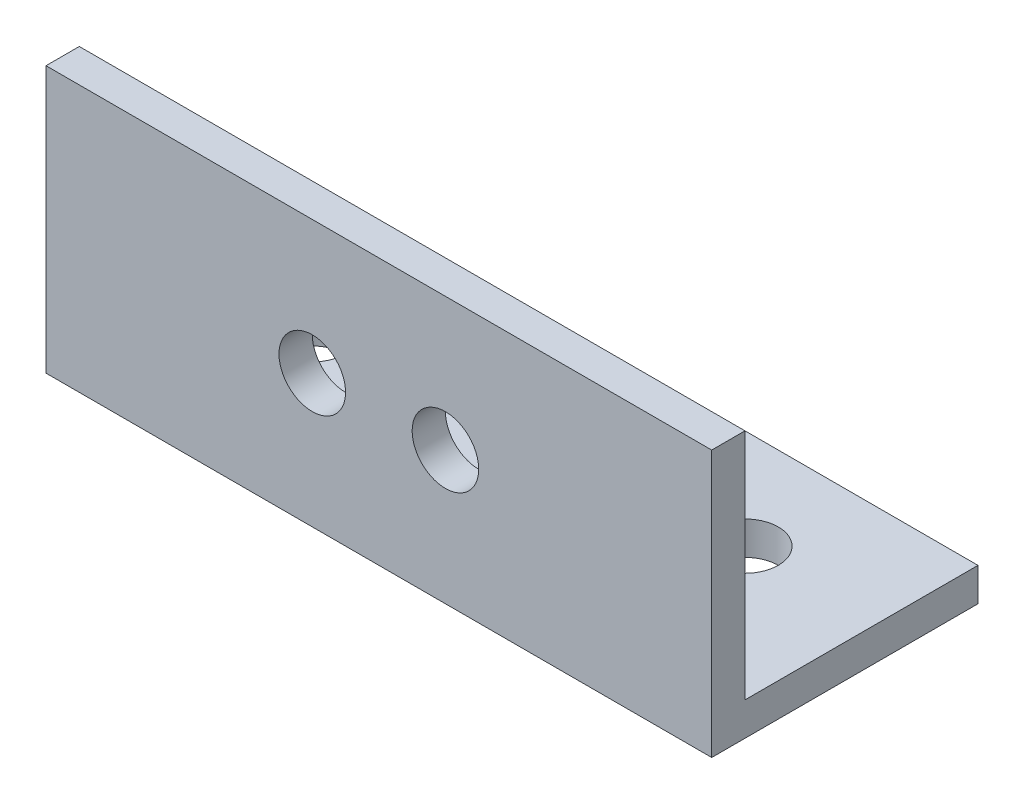
ISO-10303-21;
HEADER;
FILE_DESCRIPTION(('STEP AP214'),'2;1');
FILE_NAME('part.step','',(''),(''),'','','');
FILE_SCHEMA(('AUTOMOTIVE_DESIGN { 1 0 10303 214 1 1 1 1 }'));
ENDSEC;
DATA;
#1=APPLICATION_CONTEXT('core data for automotive mechanical design processes');
#2=APPLICATION_PROTOCOL_DEFINITION('international standard','automotive_design',2000,#1);
#3=PRODUCT_CONTEXT('',#1,'mechanical');
#4=PRODUCT('Part','Part','',(#3));
#5=PRODUCT_RELATED_PRODUCT_CATEGORY('part','',(#4));
#6=PRODUCT_DEFINITION_FORMATION('','',#4);
#7=PRODUCT_DEFINITION_CONTEXT('part definition',#1,'design');
#8=PRODUCT_DEFINITION('design','',#6,#7);
#9=PRODUCT_DEFINITION_SHAPE('','',#8);
#10=(LENGTH_UNIT() NAMED_UNIT(*) SI_UNIT(.MILLI.,.METRE.));
#11=(NAMED_UNIT(*) PLANE_ANGLE_UNIT() SI_UNIT($,.RADIAN.));
#12=(NAMED_UNIT(*) SI_UNIT($,.STERADIAN.) SOLID_ANGLE_UNIT());
#13=UNCERTAINTY_MEASURE_WITH_UNIT(LENGTH_MEASURE(1.E-05),#10,'distance_accuracy_value','');
#14=(GEOMETRIC_REPRESENTATION_CONTEXT(3) GLOBAL_UNCERTAINTY_ASSIGNED_CONTEXT((#13)) GLOBAL_UNIT_ASSIGNED_CONTEXT((#10,
#11,#12)) REPRESENTATION_CONTEXT('',''));
#15=CARTESIAN_POINT('',(0.,0.,0.));
#16=DIRECTION('',(0.,0.,1.));
#17=DIRECTION('',(1.,0.,0.));
#18=AXIS2_PLACEMENT_3D('',#15,#16,#17);
#19=CARTESIAN_POINT('',(31.75,3.175,-12.7));
#20=DIRECTION('',(-1.,0.,0.));
#21=DIRECTION('',(0.,0.,1.));
#22=AXIS2_PLACEMENT_3D('',#19,#20,#21);
#23=PLANE('',#22);
#24=DIRECTION('',(0.,0.,-1.));
#25=VECTOR('',#24,1.);
#26=CARTESIAN_POINT('',(31.75,0.,-12.7));
#27=LINE('',#26,#25);
#28=CARTESIAN_POINT('',(31.75,0.,12.7));
#29=VERTEX_POINT('',#28);
#30=CARTESIAN_POINT('',(31.75,0.,-12.7));
#31=VERTEX_POINT('',#30);
#32=EDGE_CURVE('E98',#29,#31,#27,.T.);
#33=ORIENTED_EDGE('',*,*,#32,.T.);
#34=DIRECTION('',(0.,-1.,0.));
#35=VECTOR('',#34,1.);
#36=CARTESIAN_POINT('',(31.75,3.175,-12.7));
#37=LINE('',#36,#35);
#38=CARTESIAN_POINT('',(31.75,3.175,-12.7));
#39=VERTEX_POINT('',#38);
#40=EDGE_CURVE('E11',#39,#31,#37,.T.);
#41=ORIENTED_EDGE('',*,*,#40,.F.);
#42=DIRECTION('',(0.,0.,-1.));
#43=VECTOR('',#42,1.);
#44=CARTESIAN_POINT('',(31.75,3.175,-12.7));
#45=LINE('',#44,#43);
#46=CARTESIAN_POINT('',(31.75,3.175,9.525));
#47=VERTEX_POINT('',#46);
#48=EDGE_CURVE('E91',#47,#39,#45,.T.);
#49=ORIENTED_EDGE('',*,*,#48,.F.);
#50=DIRECTION('',(0.,-1.,0.));
#51=VECTOR('',#50,1.);
#52=CARTESIAN_POINT('',(31.75,25.4,9.525));
#53=LINE('',#52,#51);
#54=CARTESIAN_POINT('',(31.75,25.4,9.525));
#55=VERTEX_POINT('',#54);
#56=EDGE_CURVE('E106',#55,#47,#53,.T.);
#57=ORIENTED_EDGE('',*,*,#56,.F.);
#58=DIRECTION('',(0.,0.,-1.));
#59=VECTOR('',#58,1.);
#60=CARTESIAN_POINT('',(31.75,25.4,12.7));
#61=LINE('',#60,#59);
#62=CARTESIAN_POINT('',(31.75,25.4,12.7));
#63=VERTEX_POINT('',#62);
#64=EDGE_CURVE('E101',#63,#55,#61,.T.);
#65=ORIENTED_EDGE('',*,*,#64,.F.);
#66=DIRECTION('',(0.,-1.,0.));
#67=VECTOR('',#66,1.);
#68=CARTESIAN_POINT('',(31.75,3.175,12.7));
#69=LINE('',#68,#67);
#70=EDGE_CURVE('E84',#63,#29,#69,.T.);
#71=ORIENTED_EDGE('',*,*,#70,.T.);
#72=EDGE_LOOP('',(#33,#41,#49,#57,#65,#71));
#73=FACE_BOUND('',#72,.T.);
#74=ADVANCED_FACE('F39',(#73),#23,.F.);
#75=CARTESIAN_POINT('',(-31.75,3.175,-12.7));
#76=DIRECTION('',(0.,0.,1.));
#77=DIRECTION('',(1.,0.,0.));
#78=AXIS2_PLACEMENT_3D('',#75,#76,#77);
#79=PLANE('',#78);
#80=DIRECTION('',(-1.,0.,0.));
#81=VECTOR('',#80,1.);
#82=CARTESIAN_POINT('',(-31.75,0.,-12.7));
#83=LINE('',#82,#81);
#84=CARTESIAN_POINT('',(-31.75,0.,-12.7));
#85=VERTEX_POINT('',#84);
#86=EDGE_CURVE('E105',#31,#85,#83,.T.);
#87=ORIENTED_EDGE('',*,*,#86,.T.);
#88=DIRECTION('',(0.,-1.,0.));
#89=VECTOR('',#88,1.);
#90=CARTESIAN_POINT('',(-31.75,3.175,-12.7));
#91=LINE('',#90,#89);
#92=CARTESIAN_POINT('',(-31.75,3.175,-12.7));
#93=VERTEX_POINT('',#92);
#94=EDGE_CURVE('E46',#93,#85,#91,.T.);
#95=ORIENTED_EDGE('',*,*,#94,.F.);
#96=DIRECTION('',(-1.,0.,0.));
#97=VECTOR('',#96,1.);
#98=CARTESIAN_POINT('',(-31.75,3.175,-12.7));
#99=LINE('',#98,#97);
#100=EDGE_CURVE('E59',#39,#93,#99,.T.);
#101=ORIENTED_EDGE('',*,*,#100,.F.);
#102=ORIENTED_EDGE('',*,*,#40,.T.);
#103=EDGE_LOOP('',(#87,#95,#101,#102));
#104=FACE_BOUND('',#103,.T.);
#105=ADVANCED_FACE('F122',(#104),#79,.F.);
#106=CARTESIAN_POINT('',(-31.75,3.175,-12.7));
#107=DIRECTION('',(1.,0.,0.));
#108=DIRECTION('',(0.,0.,-1.));
#109=AXIS2_PLACEMENT_3D('',#106,#107,#108);
#110=PLANE('',#109);
#111=DIRECTION('',(0.,0.,1.));
#112=VECTOR('',#111,1.);
#113=CARTESIAN_POINT('',(-31.75,0.,-12.7));
#114=LINE('',#113,#112);
#115=CARTESIAN_POINT('',(-31.75,0.,12.7));
#116=VERTEX_POINT('',#115);
#117=EDGE_CURVE('E92',#85,#116,#114,.T.);
#118=ORIENTED_EDGE('',*,*,#117,.T.);
#119=DIRECTION('',(0.,-1.,0.));
#120=VECTOR('',#119,1.);
#121=CARTESIAN_POINT('',(-31.75,3.175,12.7));
#122=LINE('',#121,#120);
#123=CARTESIAN_POINT('',(-31.75,25.4,12.7));
#124=VERTEX_POINT('',#123);
#125=EDGE_CURVE('E87',#124,#116,#122,.T.);
#126=ORIENTED_EDGE('',*,*,#125,.F.);
#127=DIRECTION('',(0.,0.,1.));
#128=VECTOR('',#127,1.);
#129=CARTESIAN_POINT('',(-31.75,25.4,12.7));
#130=LINE('',#129,#128);
#131=CARTESIAN_POINT('',(-31.75,25.4,9.525));
#132=VERTEX_POINT('',#131);
#133=EDGE_CURVE('E142',#132,#124,#130,.T.);
#134=ORIENTED_EDGE('',*,*,#133,.F.);
#135=DIRECTION('',(0.,-1.,0.));
#136=VECTOR('',#135,1.);
#137=CARTESIAN_POINT('',(-31.75,25.4,9.525));
#138=LINE('',#137,#136);
#139=CARTESIAN_POINT('',(-31.75,3.175,9.525));
#140=VERTEX_POINT('',#139);
#141=EDGE_CURVE('E110',#132,#140,#138,.T.);
#142=ORIENTED_EDGE('',*,*,#141,.T.);
#143=DIRECTION('',(0.,0.,1.));
#144=VECTOR('',#143,1.);
#145=CARTESIAN_POINT('',(-31.75,3.175,-12.7));
#146=LINE('',#145,#144);
#147=EDGE_CURVE('E102',#93,#140,#146,.T.);
#148=ORIENTED_EDGE('',*,*,#147,.F.);
#149=ORIENTED_EDGE('',*,*,#94,.T.);
#150=EDGE_LOOP('',(#118,#126,#134,#142,#148,#149));
#151=FACE_BOUND('',#150,.T.);
#152=ADVANCED_FACE('F119',(#151),#110,.F.);
#153=CARTESIAN_POINT('',(-31.75,3.175,12.7));
#154=DIRECTION('',(0.,0.,-1.));
#155=DIRECTION('',(-1.,0.,0.));
#156=AXIS2_PLACEMENT_3D('',#153,#154,#155);
#157=PLANE('',#156);
#158=CARTESIAN_POINT('',(6.34999999999999,12.7,12.7));
#159=DIRECTION('',(0.,0.,-1.));
#160=DIRECTION('',(-1.,0.,0.));
#161=AXIS2_PLACEMENT_3D('',#158,#159,#160);
#162=CIRCLE('',#161,3.175);
#163=CARTESIAN_POINT('',(3.17499999999999,12.7,12.7));
#164=VERTEX_POINT('',#163);
#165=EDGE_CURVE('E155',#164,#164,#162,.T.);
#166=ORIENTED_EDGE('',*,*,#165,.T.);
#167=EDGE_LOOP('',(#166));
#168=FACE_BOUND('',#167,.T.);
#169=CARTESIAN_POINT('',(-6.35000000000001,12.7,12.7));
#170=DIRECTION('',(0.,0.,-1.));
#171=DIRECTION('',(-1.,0.,0.));
#172=AXIS2_PLACEMENT_3D('',#169,#170,#171);
#173=CIRCLE('',#172,3.175);
#174=CARTESIAN_POINT('',(-9.52500000000001,12.7,12.7));
#175=VERTEX_POINT('',#174);
#176=EDGE_CURVE('E143',#175,#175,#173,.T.);
#177=ORIENTED_EDGE('',*,*,#176,.T.);
#178=EDGE_LOOP('',(#177));
#179=FACE_BOUND('',#178,.T.);
#180=DIRECTION('',(1.,0.,0.));
#181=VECTOR('',#180,1.);
#182=CARTESIAN_POINT('',(-31.75,0.,12.7));
#183=LINE('',#182,#181);
#184=EDGE_CURVE('E79',#116,#29,#183,.T.);
#185=ORIENTED_EDGE('',*,*,#184,.T.);
#186=ORIENTED_EDGE('',*,*,#70,.F.);
#187=DIRECTION('',(1.,0.,0.));
#188=VECTOR('',#187,1.);
#189=CARTESIAN_POINT('',(-31.75,25.4,12.7));
#190=LINE('',#189,#188);
#191=EDGE_CURVE('E138',#124,#63,#190,.T.);
#192=ORIENTED_EDGE('',*,*,#191,.F.);
#193=ORIENTED_EDGE('',*,*,#125,.T.);
#194=EDGE_LOOP('',(#185,#186,#192,#193));
#195=FACE_BOUND('',#194,.T.);
#196=ADVANCED_FACE('F81',(#168,#179,#195),#157,.F.);
#197=CARTESIAN_POINT('',(0.,3.175,0.));
#198=DIRECTION('',(0.,1.,0.));
#199=DIRECTION('',(0.,0.,1.));
#200=AXIS2_PLACEMENT_3D('',#197,#198,#199);
#201=PLANE('',#200);
#202=CARTESIAN_POINT('',(19.05,3.175,-3.175));
#203=DIRECTION('',(0.,1.,0.));
#204=DIRECTION('',(0.,0.,1.));
#205=AXIS2_PLACEMENT_3D('',#202,#203,#204);
#206=CIRCLE('',#205,3.175);
#207=CARTESIAN_POINT('',(19.05,3.175,0.));
#208=VERTEX_POINT('',#207);
#209=EDGE_CURVE('E170',#208,#208,#206,.T.);
#210=ORIENTED_EDGE('',*,*,#209,.F.);
#211=EDGE_LOOP('',(#210));
#212=FACE_BOUND('',#211,.T.);
#213=CARTESIAN_POINT('',(-19.05,3.175,0.));
#214=DIRECTION('',(0.,1.,0.));
#215=DIRECTION('',(0.,0.,1.));
#216=AXIS2_PLACEMENT_3D('',#213,#214,#215);
#217=CIRCLE('',#216,3.175);
#218=CARTESIAN_POINT('',(-19.05,3.175,3.175));
#219=VERTEX_POINT('',#218);
#220=EDGE_CURVE('E164',#219,#219,#217,.T.);
#221=ORIENTED_EDGE('',*,*,#220,.F.);
#222=EDGE_LOOP('',(#221));
#223=FACE_BOUND('',#222,.T.);
#224=DIRECTION('',(-1.,0.,0.));
#225=VECTOR('',#224,1.);
#226=CARTESIAN_POINT('',(-31.75,3.175,9.525));
#227=LINE('',#226,#225);
#228=EDGE_CURVE('E53',#47,#140,#227,.T.);
#229=ORIENTED_EDGE('',*,*,#228,.F.);
#230=ORIENTED_EDGE('',*,*,#48,.T.);
#231=ORIENTED_EDGE('',*,*,#100,.T.);
#232=ORIENTED_EDGE('',*,*,#147,.T.);
#233=EDGE_LOOP('',(#229,#230,#231,#232));
#234=FACE_BOUND('',#233,.T.);
#235=ADVANCED_FACE('F144',(#212,#223,#234),#201,.T.);
#236=CARTESIAN_POINT('',(0.,0.,0.));
#237=DIRECTION('',(0.,1.,0.));
#238=DIRECTION('',(0.,0.,1.));
#239=AXIS2_PLACEMENT_3D('',#236,#237,#238);
#240=PLANE('',#239);
#241=CARTESIAN_POINT('',(19.05,0.,-3.175));
#242=DIRECTION('',(0.,1.,0.));
#243=DIRECTION('',(0.,0.,1.));
#244=AXIS2_PLACEMENT_3D('',#241,#242,#243);
#245=CIRCLE('',#244,3.175);
#246=CARTESIAN_POINT('',(19.05,0.,0.));
#247=VERTEX_POINT('',#246);
#248=EDGE_CURVE('E167',#247,#247,#245,.T.);
#249=ORIENTED_EDGE('',*,*,#248,.T.);
#250=EDGE_LOOP('',(#249));
#251=FACE_BOUND('',#250,.T.);
#252=CARTESIAN_POINT('',(-19.05,0.,0.));
#253=DIRECTION('',(0.,1.,0.));
#254=DIRECTION('',(0.,0.,1.));
#255=AXIS2_PLACEMENT_3D('',#252,#253,#254);
#256=CIRCLE('',#255,3.175);
#257=CARTESIAN_POINT('',(-19.05,0.,3.175));
#258=VERTEX_POINT('',#257);
#259=EDGE_CURVE('E161',#258,#258,#256,.T.);
#260=ORIENTED_EDGE('',*,*,#259,.T.);
#261=EDGE_LOOP('',(#260));
#262=FACE_BOUND('',#261,.T.);
#263=ORIENTED_EDGE('',*,*,#32,.F.);
#264=ORIENTED_EDGE('',*,*,#184,.F.);
#265=ORIENTED_EDGE('',*,*,#117,.F.);
#266=ORIENTED_EDGE('',*,*,#86,.F.);
#267=EDGE_LOOP('',(#263,#264,#265,#266));
#268=FACE_BOUND('',#267,.T.);
#269=ADVANCED_FACE('F104',(#251,#262,#268),#240,.F.);
#270=CARTESIAN_POINT('',(-31.75,25.4,9.525));
#271=DIRECTION('',(0.,0.,1.));
#272=DIRECTION('',(1.,0.,0.));
#273=AXIS2_PLACEMENT_3D('',#270,#271,#272);
#274=PLANE('',#273);
#275=CARTESIAN_POINT('',(6.34999999999999,12.7,9.525));
#276=DIRECTION('',(0.,0.,-1.));
#277=DIRECTION('',(-1.,0.,0.));
#278=AXIS2_PLACEMENT_3D('',#275,#276,#277);
#279=CIRCLE('',#278,3.175);
#280=CARTESIAN_POINT('',(3.17499999999999,12.7,9.525));
#281=VERTEX_POINT('',#280);
#282=EDGE_CURVE('E158',#281,#281,#279,.T.);
#283=ORIENTED_EDGE('',*,*,#282,.F.);
#284=EDGE_LOOP('',(#283));
#285=FACE_BOUND('',#284,.T.);
#286=CARTESIAN_POINT('',(-6.35000000000001,12.7,9.525));
#287=DIRECTION('',(0.,0.,-1.));
#288=DIRECTION('',(-1.,0.,0.));
#289=AXIS2_PLACEMENT_3D('',#286,#287,#288);
#290=CIRCLE('',#289,3.175);
#291=CARTESIAN_POINT('',(-9.52500000000001,12.7,9.525));
#292=VERTEX_POINT('',#291);
#293=EDGE_CURVE('E152',#292,#292,#290,.T.);
#294=ORIENTED_EDGE('',*,*,#293,.F.);
#295=EDGE_LOOP('',(#294));
#296=FACE_BOUND('',#295,.T.);
#297=ORIENTED_EDGE('',*,*,#228,.T.);
#298=ORIENTED_EDGE('',*,*,#141,.F.);
#299=DIRECTION('',(-1.,0.,0.));
#300=VECTOR('',#299,1.);
#301=CARTESIAN_POINT('',(-31.75,25.4,9.525));
#302=LINE('',#301,#300);
#303=EDGE_CURVE('E131',#55,#132,#302,.T.);
#304=ORIENTED_EDGE('',*,*,#303,.F.);
#305=ORIENTED_EDGE('',*,*,#56,.T.);
#306=EDGE_LOOP('',(#297,#298,#304,#305));
#307=FACE_BOUND('',#306,.T.);
#308=ADVANCED_FACE('F127',(#285,#296,#307),#274,.F.);
#309=CARTESIAN_POINT('',(0.,25.4,0.));
#310=DIRECTION('',(0.,-1.,0.));
#311=DIRECTION('',(0.,0.,-1.));
#312=AXIS2_PLACEMENT_3D('',#309,#310,#311);
#313=PLANE('',#312);
#314=ORIENTED_EDGE('',*,*,#133,.T.);
#315=ORIENTED_EDGE('',*,*,#191,.T.);
#316=ORIENTED_EDGE('',*,*,#64,.T.);
#317=ORIENTED_EDGE('',*,*,#303,.T.);
#318=EDGE_LOOP('',(#314,#315,#316,#317));
#319=FACE_BOUND('',#318,.T.);
#320=ADVANCED_FACE('F149',(#319),#313,.F.);
#321=CARTESIAN_POINT('',(-6.35000000000001,12.7,12.7));
#322=DIRECTION('',(0.,0.,-1.));
#323=DIRECTION('',(-1.,0.,0.));
#324=AXIS2_PLACEMENT_3D('',#321,#322,#323);
#325=CYLINDRICAL_SURFACE('',#324,3.175);
#326=ORIENTED_EDGE('',*,*,#176,.F.);
#327=EDGE_LOOP('',(#326));
#328=FACE_BOUND('',#327,.T.);
#329=ORIENTED_EDGE('',*,*,#293,.T.);
#330=EDGE_LOOP('',(#329));
#331=FACE_BOUND('',#330,.T.);
#332=ADVANCED_FACE('F198',(#328,#331),#325,.F.);
#333=CARTESIAN_POINT('',(6.34999999999999,12.7,12.7));
#334=DIRECTION('',(0.,0.,-1.));
#335=DIRECTION('',(-1.,0.,0.));
#336=AXIS2_PLACEMENT_3D('',#333,#334,#335);
#337=CYLINDRICAL_SURFACE('',#336,3.175);
#338=ORIENTED_EDGE('',*,*,#165,.F.);
#339=EDGE_LOOP('',(#338));
#340=FACE_BOUND('',#339,.T.);
#341=ORIENTED_EDGE('',*,*,#282,.T.);
#342=EDGE_LOOP('',(#341));
#343=FACE_BOUND('',#342,.T.);
#344=ADVANCED_FACE('F191',(#340,#343),#337,.F.);
#345=CARTESIAN_POINT('',(-19.05,0.,0.));
#346=DIRECTION('',(0.,1.,0.));
#347=DIRECTION('',(0.,0.,1.));
#348=AXIS2_PLACEMENT_3D('',#345,#346,#347);
#349=CYLINDRICAL_SURFACE('',#348,3.175);
#350=ORIENTED_EDGE('',*,*,#259,.F.);
#351=EDGE_LOOP('',(#350));
#352=FACE_BOUND('',#351,.T.);
#353=ORIENTED_EDGE('',*,*,#220,.T.);
#354=EDGE_LOOP('',(#353));
#355=FACE_BOUND('',#354,.T.);
#356=ADVANCED_FACE('F181',(#352,#355),#349,.F.);
#357=CARTESIAN_POINT('',(19.05,0.,-3.175));
#358=DIRECTION('',(0.,1.,0.));
#359=DIRECTION('',(0.,0.,1.));
#360=AXIS2_PLACEMENT_3D('',#357,#358,#359);
#361=CYLINDRICAL_SURFACE('',#360,3.175);
#362=ORIENTED_EDGE('',*,*,#248,.F.);
#363=EDGE_LOOP('',(#362));
#364=FACE_BOUND('',#363,.T.);
#365=ORIENTED_EDGE('',*,*,#209,.T.);
#366=EDGE_LOOP('',(#365));
#367=FACE_BOUND('',#366,.T.);
#368=ADVANCED_FACE('F178',(#364,#367),#361,.F.);
#369=CLOSED_SHELL('',(#74,#105,#152,#196,#235,#269,#308,#320,#332,#344,#356,#368));
#370=MANIFOLD_SOLID_BREP('B2',#369);
#371=ADVANCED_BREP_SHAPE_REPRESENTATION('',(#18,#370),#14);
#372=SHAPE_DEFINITION_REPRESENTATION(#9,#371);
ENDSEC;
END-ISO-10303-21;
